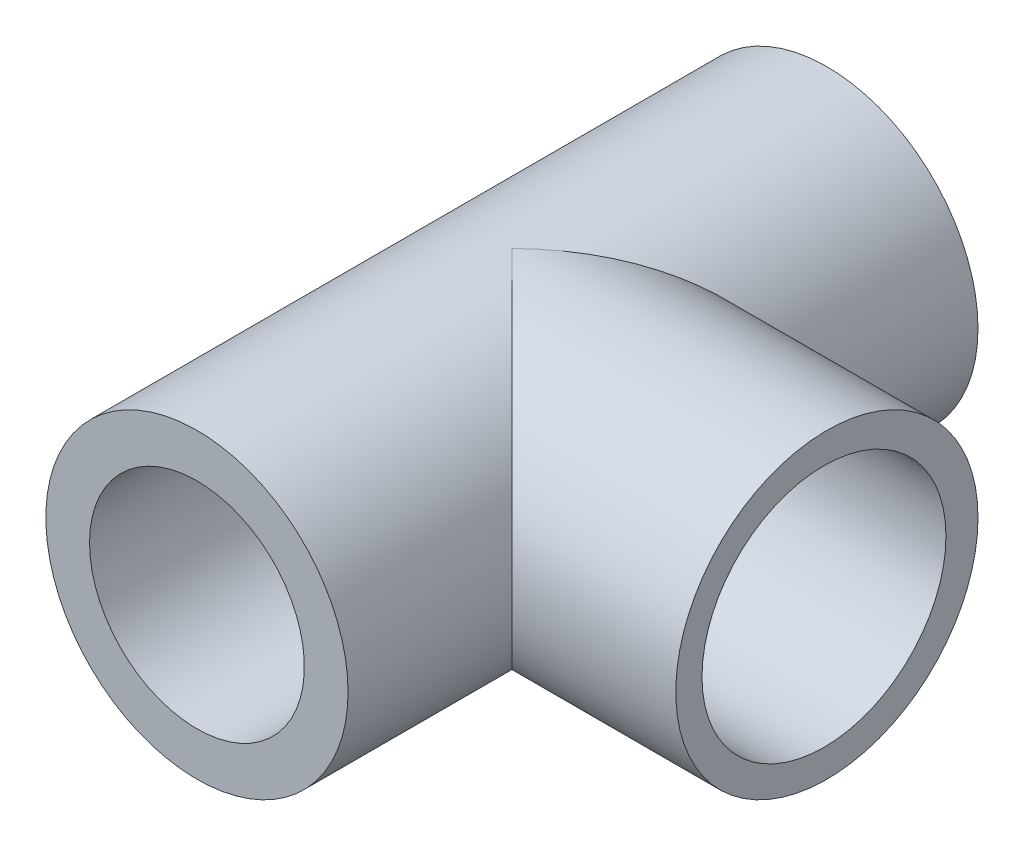
ISO-10303-21;
HEADER;
FILE_DESCRIPTION(('STEP AP214'),'2;1');
FILE_NAME('part.step','',(''),(''),'','','');
FILE_SCHEMA(('AUTOMOTIVE_DESIGN { 1 0 10303 214 1 1 1 1 }'));
ENDSEC;
DATA;
#1=APPLICATION_CONTEXT('core data for automotive mechanical design processes');
#2=APPLICATION_PROTOCOL_DEFINITION('international standard','automotive_design',2000,#1);
#3=PRODUCT_CONTEXT('',#1,'mechanical');
#4=PRODUCT('Part','Part','',(#3));
#5=PRODUCT_RELATED_PRODUCT_CATEGORY('part','',(#4));
#6=PRODUCT_DEFINITION_FORMATION('','',#4);
#7=PRODUCT_DEFINITION_CONTEXT('part definition',#1,'design');
#8=PRODUCT_DEFINITION('design','',#6,#7);
#9=PRODUCT_DEFINITION_SHAPE('','',#8);
#10=(LENGTH_UNIT() NAMED_UNIT(*) SI_UNIT(.MILLI.,.METRE.));
#11=(NAMED_UNIT(*) PLANE_ANGLE_UNIT() SI_UNIT($,.RADIAN.));
#12=(NAMED_UNIT(*) SI_UNIT($,.STERADIAN.) SOLID_ANGLE_UNIT());
#13=UNCERTAINTY_MEASURE_WITH_UNIT(LENGTH_MEASURE(1.E-05),#10,'distance_accuracy_value','');
#14=(GEOMETRIC_REPRESENTATION_CONTEXT(3) GLOBAL_UNCERTAINTY_ASSIGNED_CONTEXT((#13)) GLOBAL_UNIT_ASSIGNED_CONTEXT((#10,
#11,#12)) REPRESENTATION_CONTEXT('',''));
#15=CARTESIAN_POINT('',(0.,0.,0.));
#16=DIRECTION('',(0.,0.,1.));
#17=DIRECTION('',(1.,0.,0.));
#18=AXIS2_PLACEMENT_3D('',#15,#16,#17);
#19=CARTESIAN_POINT('',(8.5328125,0.,34.6470305744175));
#20=DIRECTION('',(1.,0.,0.));
#21=DIRECTION('',(0.,0.,-1.));
#22=AXIS2_PLACEMENT_3D('',#19,#20,#21);
#23=PLANE('',#22);
#24=DIRECTION('',(0.,0.,-1.));
#25=VECTOR('',#24,1.);
#26=CARTESIAN_POINT('',(8.5328125,-8.0164820448249,68.659375));
#27=LINE('',#26,#25);
#28=CARTESIAN_POINT('',(8.5328125,-8.0164820448249,45.2536959362387));
#29=VERTEX_POINT('',#28);
#30=CARTESIAN_POINT('',(8.5328125,-8.01648204482489,42.8625));
#31=VERTEX_POINT('',#30);
#32=EDGE_CURVE('E109',#29,#31,#27,.T.);
#33=ORIENTED_EDGE('',*,*,#32,.F.);
#34=CARTESIAN_POINT('',(8.5328125,0.,34.6470305744175));
#35=DIRECTION('',(1.,0.,0.));
#36=DIRECTION('',(0.,0.,-1.));
#37=AXIS2_PLACEMENT_3D('',#34,#35,#36);
#38=CIRCLE('',#37,13.2953125);
#39=CARTESIAN_POINT('',(8.5328125,-8.0164820448249,24.0403652125964));
#40=VERTEX_POINT('',#39);
#41=EDGE_CURVE('E107',#29,#40,#38,.T.);
#42=ORIENTED_EDGE('',*,*,#41,.T.);
#43=CARTESIAN_POINT('',(8.5328125,-8.01648204482489,25.796875));
#44=VERTEX_POINT('',#43);
#45=EDGE_CURVE('E95',#44,#40,#27,.T.);
#46=ORIENTED_EDGE('',*,*,#45,.F.);
#47=CARTESIAN_POINT('',(8.5328125,0.,34.3296875));
#48=DIRECTION('',(1.,0.,0.));
#49=DIRECTION('',(0.,0.,-1.));
#50=AXIS2_PLACEMENT_3D('',#47,#48,#49);
#51=CIRCLE('',#50,11.7078125);
#52=EDGE_CURVE('E105',#44,#31,#51,.F.);
#53=ORIENTED_EDGE('',*,*,#52,.T.);
#54=EDGE_LOOP('',(#33,#42,#46,#53));
#55=FACE_BOUND('',#54,.T.);
#56=ADVANCED_FACE('F41',(#55),#23,.T.);
#57=CARTESIAN_POINT('',(0.,0.,34.3296875));
#58=DIRECTION('',(1.,0.,0.));
#59=DIRECTION('',(0.,0.,-1.));
#60=AXIS2_PLACEMENT_3D('',#57,#58,#59);
#61=CYLINDRICAL_SURFACE('',#60,11.7078125);
#62=CARTESIAN_POINT('',(8.5328125,8.0164820448249,42.8625));
#63=VERTEX_POINT('',#62);
#64=CARTESIAN_POINT('',(8.5328125,8.0164820448249,25.796875));
#65=VERTEX_POINT('',#64);
#66=EDGE_CURVE('E115',#63,#65,#51,.F.);
#67=ORIENTED_EDGE('',*,*,#66,.F.);
#68=CARTESIAN_POINT('',(0.,0.,34.3296875));
#69=DIRECTION('',(0.707106781186547,0.,-0.707106781186547));
#70=DIRECTION('',(0.707106781186547,0.,0.707106781186547));
#71=AXIS2_PLACEMENT_3D('',#68,#69,#70);
#72=ELLIPSE('',#71,16.5573472232212,11.7078125);
#73=CARTESIAN_POINT('',(0.,11.7078125,34.3296875));
#74=VERTEX_POINT('',#73);
#75=EDGE_CURVE('E11',#63,#74,#72,.F.);
#76=ORIENTED_EDGE('',*,*,#75,.T.);
#77=CARTESIAN_POINT('',(0.,0.,34.3296875));
#78=DIRECTION('',(0.707106781186547,0.,0.707106781186547));
#79=DIRECTION('',(0.707106781186547,0.,-0.707106781186547));
#80=AXIS2_PLACEMENT_3D('',#77,#78,#79);
#81=ELLIPSE('',#80,16.5573472232212,11.7078125);
#82=EDGE_CURVE('E51',#74,#65,#81,.F.);
#83=ORIENTED_EDGE('',*,*,#82,.T.);
#84=EDGE_LOOP('',(#67,#76,#83));
#85=FACE_BOUND('',#84,.T.);
#86=ADVANCED_FACE('F184',(#85),#61,.F.);
#87=CARTESIAN_POINT('',(0.,0.,68.659375));
#88=DIRECTION('',(0.,0.,-1.));
#89=DIRECTION('',(-1.,0.,0.));
#90=AXIS2_PLACEMENT_3D('',#87,#88,#89);
#91=CYLINDRICAL_SURFACE('',#90,16.4703125);
#92=CARTESIAN_POINT('',(0.,0.,0.));
#93=DIRECTION('',(0.,0.,1.));
#94=DIRECTION('',(1.,0.,0.));
#95=AXIS2_PLACEMENT_3D('',#92,#93,#94);
#96=CIRCLE('',#95,16.4703125);
#97=CARTESIAN_POINT('',(16.4703125,0.,0.));
#98=VERTEX_POINT('',#97);
#99=EDGE_CURVE('E120',#98,#98,#96,.T.);
#100=ORIENTED_EDGE('',*,*,#99,.T.);
#101=EDGE_LOOP('',(#100));
#102=FACE_BOUND('',#101,.T.);
#103=CARTESIAN_POINT('',(0.,0.,68.659375));
#104=DIRECTION('',(0.,0.,1.));
#105=DIRECTION('',(1.,0.,0.));
#106=AXIS2_PLACEMENT_3D('',#103,#104,#105);
#107=CIRCLE('',#106,16.4703125);
#108=CARTESIAN_POINT('',(16.4703125,0.,68.659375));
#109=VERTEX_POINT('',#108);
#110=EDGE_CURVE('E129',#109,#109,#107,.T.);
#111=ORIENTED_EDGE('',*,*,#110,.F.);
#112=EDGE_LOOP('',(#111));
#113=FACE_BOUND('',#112,.T.);
#114=CARTESIAN_POINT('',(0.,0.,34.3296875));
#115=DIRECTION('',(-0.707106781186547,0.,-0.707106781186547));
#116=DIRECTION('',(0.707106781186547,0.,-0.707106781186547));
#117=AXIS2_PLACEMENT_3D('',#114,#115,#116);
#118=ELLIPSE('',#117,23.2925393140231,16.4703125);
#119=CARTESIAN_POINT('',(0.,-16.4703125,34.3296875));
#120=VERTEX_POINT('',#119);
#121=CARTESIAN_POINT('',(0.,16.4703125,34.3296875));
#122=VERTEX_POINT('',#121);
#123=EDGE_CURVE('E100',#120,#122,#118,.F.);
#124=ORIENTED_EDGE('',*,*,#123,.F.);
#125=CARTESIAN_POINT('',(0.,0.,34.3296875));
#126=DIRECTION('',(0.707106781186547,0.,-0.707106781186547));
#127=DIRECTION('',(-0.707106781186547,0.,-0.707106781186547));
#128=AXIS2_PLACEMENT_3D('',#125,#126,#127);
#129=ELLIPSE('',#128,23.2925393140231,16.4703125);
#130=EDGE_CURVE('E64',#122,#120,#129,.T.);
#131=ORIENTED_EDGE('',*,*,#130,.F.);
#132=EDGE_LOOP('',(#124,#131));
#133=FACE_BOUND('',#132,.T.);
#134=ADVANCED_FACE('F43',(#102,#113,#133),#91,.T.);
#135=CARTESIAN_POINT('',(0.,0.,68.659375));
#136=DIRECTION('',(0.,0.,1.));
#137=DIRECTION('',(1.,0.,0.));
#138=AXIS2_PLACEMENT_3D('',#135,#136,#137);
#139=PLANE('',#138);
#140=CARTESIAN_POINT('',(0.,0.,68.659375));
#141=DIRECTION('',(0.,0.,-1.));
#142=DIRECTION('',(-1.,0.,0.));
#143=AXIS2_PLACEMENT_3D('',#140,#141,#142);
#144=CIRCLE('',#143,11.7078125);
#145=CARTESIAN_POINT('',(-11.7078125,0.,68.659375));
#146=VERTEX_POINT('',#145);
#147=EDGE_CURVE('E110',#146,#146,#144,.T.);
#148=ORIENTED_EDGE('',*,*,#147,.T.);
#149=EDGE_LOOP('',(#148));
#150=FACE_BOUND('',#149,.T.);
#151=ORIENTED_EDGE('',*,*,#110,.T.);
#152=EDGE_LOOP('',(#151));
#153=FACE_BOUND('',#152,.T.);
#154=ADVANCED_FACE('F192',(#150,#153),#139,.T.);
#155=CARTESIAN_POINT('',(0.,0.,0.));
#156=DIRECTION('',(0.,0.,1.));
#157=DIRECTION('',(1.,0.,0.));
#158=AXIS2_PLACEMENT_3D('',#155,#156,#157);
#159=PLANE('',#158);
#160=CARTESIAN_POINT('',(0.,0.,0.));
#161=DIRECTION('',(0.,0.,-1.));
#162=DIRECTION('',(-1.,0.,0.));
#163=AXIS2_PLACEMENT_3D('',#160,#161,#162);
#164=CIRCLE('',#163,11.7078125);
#165=CARTESIAN_POINT('',(-11.7078125,0.,0.));
#166=VERTEX_POINT('',#165);
#167=EDGE_CURVE('E272',#166,#166,#164,.T.);
#168=ORIENTED_EDGE('',*,*,#167,.F.);
#169=EDGE_LOOP('',(#168));
#170=FACE_BOUND('',#169,.T.);
#171=ORIENTED_EDGE('',*,*,#99,.F.);
#172=EDGE_LOOP('',(#171));
#173=FACE_BOUND('',#172,.T.);
#174=ADVANCED_FACE('F239',(#170,#173),#159,.F.);
#175=CARTESIAN_POINT('',(34.3296875,0.,34.3296875));
#176=DIRECTION('',(-1.,0.,0.));
#177=DIRECTION('',(0.,0.,1.));
#178=AXIS2_PLACEMENT_3D('',#175,#176,#177);
#179=CYLINDRICAL_SURFACE('',#178,16.4703125);
#180=CARTESIAN_POINT('',(34.3296875,0.,34.3296875));
#181=DIRECTION('',(1.,0.,0.));
#182=DIRECTION('',(0.,0.,-1.));
#183=AXIS2_PLACEMENT_3D('',#180,#181,#182);
#184=CIRCLE('',#183,16.4703125);
#185=CARTESIAN_POINT('',(34.3296875,0.,17.859375));
#186=VERTEX_POINT('',#185);
#187=EDGE_CURVE('E114',#186,#186,#184,.T.);
#188=ORIENTED_EDGE('',*,*,#187,.F.);
#189=EDGE_LOOP('',(#188));
#190=FACE_BOUND('',#189,.T.);
#191=ORIENTED_EDGE('',*,*,#130,.T.);
#192=ORIENTED_EDGE('',*,*,#123,.T.);
#193=EDGE_LOOP('',(#191,#192));
#194=FACE_BOUND('',#193,.T.);
#195=ADVANCED_FACE('F179',(#190,#194),#179,.T.);
#196=CARTESIAN_POINT('',(34.3296875,0.,34.3296875));
#197=DIRECTION('',(1.,0.,0.));
#198=DIRECTION('',(0.,0.,-1.));
#199=AXIS2_PLACEMENT_3D('',#196,#197,#198);
#200=PLANE('',#199);
#201=CARTESIAN_POINT('',(34.3296875,0.,34.6470305744175));
#202=DIRECTION('',(1.,0.,0.));
#203=DIRECTION('',(0.,0.,-1.));
#204=AXIS2_PLACEMENT_3D('',#201,#202,#203);
#205=CIRCLE('',#204,13.2953125);
#206=CARTESIAN_POINT('',(34.3296875,0.,21.3517180744175));
#207=VERTEX_POINT('',#206);
#208=EDGE_CURVE('E136',#207,#207,#205,.T.);
#209=ORIENTED_EDGE('',*,*,#208,.F.);
#210=EDGE_LOOP('',(#209));
#211=FACE_BOUND('',#210,.T.);
#212=ORIENTED_EDGE('',*,*,#187,.T.);
#213=EDGE_LOOP('',(#212));
#214=FACE_BOUND('',#213,.T.);
#215=ADVANCED_FACE('F172',(#211,#214),#200,.T.);
#216=DIRECTION('',(0.,0.,-1.));
#217=VECTOR('',#216,1.);
#218=CARTESIAN_POINT('',(8.5328125,8.0164820448249,68.659375));
#219=LINE('',#218,#217);
#220=CARTESIAN_POINT('',(8.5328125,8.0164820448249,24.0403652125964));
#221=VERTEX_POINT('',#220);
#222=EDGE_CURVE('E140',#221,#65,#219,.F.);
#223=ORIENTED_EDGE('',*,*,#222,.F.);
#224=CARTESIAN_POINT('',(8.5328125,8.0164820448249,45.2536959362387));
#225=VERTEX_POINT('',#224);
#226=EDGE_CURVE('E123',#221,#225,#38,.T.);
#227=ORIENTED_EDGE('',*,*,#226,.T.);
#228=EDGE_CURVE('E144',#63,#225,#219,.F.);
#229=ORIENTED_EDGE('',*,*,#228,.F.);
#230=ORIENTED_EDGE('',*,*,#66,.T.);
#231=EDGE_LOOP('',(#223,#227,#229,#230));
#232=FACE_BOUND('',#231,.T.);
#233=ADVANCED_FACE('F169',(#232),#23,.T.);
#234=CARTESIAN_POINT('',(8.5328125,0.,34.6470305744175));
#235=DIRECTION('',(1.,0.,0.));
#236=DIRECTION('',(0.,0.,-1.));
#237=AXIS2_PLACEMENT_3D('',#234,#235,#236);
#238=CYLINDRICAL_SURFACE('',#237,13.2953125);
#239=ORIENTED_EDGE('',*,*,#41,.F.);
#240=CARTESIAN_POINT('',(8.5328125,-8.0164820448249,45.2536959362387));
#241=CARTESIAN_POINT('',(8.72890101178697,-7.80773782197861,45.4114771458775));
#242=CARTESIAN_POINT('',(8.91866696131001,-7.59042340095997,45.5660254481017));
#243=CARTESIAN_POINT('',(9.28441040605854,-7.13844176275085,45.8667318873889));
#244=CARTESIAN_POINT('',(9.46036893816848,-6.90375151199532,46.0128784143072));
#245=CARTESIAN_POINT('',(9.79808637693156,-6.41553515165995,46.2954814489118));
#246=CARTESIAN_POINT('',(9.95972813405647,-6.16188028886602,46.4318565281448));
#247=CARTESIAN_POINT('',(10.2654371194852,-5.6378732956996,46.6913286770782));
#248=CARTESIAN_POINT('',(10.4095135008709,-5.36752997304911,46.8144326582649));
#249=CARTESIAN_POINT('',(10.6559355803692,-4.85699736949685,47.0259694575789));
#250=CARTESIAN_POINT('',(10.7612420478127,-4.61921608636038,47.1167691464204));
#251=CARTESIAN_POINT('',(10.9570195222991,-4.13341828985814,47.2861097638865));
#252=CARTESIAN_POINT('',(11.0474935211812,-3.88540385327353,47.3646531645579));
#253=CARTESIAN_POINT('',(11.2121429577322,-3.38096240448729,47.507939214743));
#254=CARTESIAN_POINT('',(11.2863642613359,-3.12456147598377,47.5727206852601));
#255=CARTESIAN_POINT('',(11.4176724920056,-2.60415646472054,47.6875324956594));
#256=CARTESIAN_POINT('',(11.4747596885235,-2.34015250159813,47.7375630675149));
#257=CARTESIAN_POINT('',(11.5711349601488,-1.80451122016918,47.8221239804047));
#258=CARTESIAN_POINT('',(11.610296783073,-1.53283364672165,47.8565443604323));
#259=CARTESIAN_POINT('',(11.6694803626076,-0.985791015268656,47.9085928470477));
#260=CARTESIAN_POINT('',(11.6895019072841,-0.71042591646666,47.9262207676982));
#261=CARTESIAN_POINT('',(11.710003160003,-0.158283914775586,47.9442713143612));
#262=CARTESIAN_POINT('',(11.7104743909105,0.118493548502463,47.9446864768168));
#263=CARTESIAN_POINT('',(11.6918420524494,0.670860128265111,47.928280944949));
#264=CARTESIAN_POINT('',(11.6727398532898,0.946449326576323,47.9114614571117));
#265=CARTESIAN_POINT('',(11.6181831965574,1.46708021452744,47.8634784112041));
#266=CARTESIAN_POINT('',(11.5845226715159,1.71245947358449,47.8338890881977));
#267=CARTESIAN_POINT('',(11.5021441536161,2.19871797650703,47.761579415468));
#268=CARTESIAN_POINT('',(11.4534254886102,2.43959701898799,47.7188584795915));
#269=CARTESIAN_POINT('',(11.3416565503991,2.91537534114862,47.6210393599123));
#270=CARTESIAN_POINT('',(11.2786088874855,3.15027570129965,47.5659434304644));
#271=CARTESIAN_POINT('',(11.1390182093329,3.61296978364089,47.4442575609299));
#272=CARTESIAN_POINT('',(11.062474597056,3.84076319090657,47.3776671123481));
#273=CARTESIAN_POINT('',(10.8920284911145,4.30119465309535,47.2298300699175));
#274=CARTESIAN_POINT('',(10.7973799321653,4.53335562734828,47.1479600929696));
#275=CARTESIAN_POINT('',(10.5950710142502,4.98791197015893,46.9736422399046));
#276=CARTESIAN_POINT('',(10.487405723303,5.21030359336752,46.8811903550614));
#277=CARTESIAN_POINT('',(10.2601146542697,5.64473635898065,46.6869196018081));
#278=CARTESIAN_POINT('',(10.1404843282723,5.85677351972898,46.5850971728364));
#279=CARTESIAN_POINT('',(9.8902739618812,6.27006516409971,46.3733068029686));
#280=CARTESIAN_POINT('',(9.75969216910489,6.47131791359428,46.2633375588017));
#281=CARTESIAN_POINT('',(9.45630368478822,6.90927276509099,46.0094965192659));
#282=CARTESIAN_POINT('',(9.28083053609682,7.14305333849247,45.8637724197562));
#283=CARTESIAN_POINT('',(8.91655642974811,7.59284173563018,45.5643063172713));
#284=CARTESIAN_POINT('',(8.72780459675764,7.80890926333424,45.4105943656232));
#285=CARTESIAN_POINT('',(8.5328125,8.0164820448249,45.2536959362387));
#286=B_SPLINE_CURVE_WITH_KNOTS('',3,(#240,#241,#242,#243,#244,#245,#246,#247,#248,#249,#250,
#251,#252,#253,#254,#255,#256,#257,#258,#259,#260,#261,#262,#263,#264,#265,#266,#267,#268,#269,
#270,#271,#272,#273,#274,#275,#276,#277,#278,#279,#280,#281,#282,#283,#284,#285),.UNSPECIFIED.,
.F.,.F.,(4,2,2,2,2,2,2,2,2,2,2,2,2,2,2,2,2,2,2,2,2,2,4),(0.,0.980948678495349,1.96322183345979,
2.95290603880762,3.94207230855386,4.76763630578725,5.59303357407598,6.41607061984179,
7.23909472180484,8.06782958203569,8.89657361847208,9.72567699961188,10.5547223445627,
11.3021932504509,12.0496975258984,12.7970657386421,13.544467021992,14.3349314892972,
15.1256964042517,15.9167630396492,16.707956498789,17.6869114671665,18.662418054043),.UNSPECIFIED.);
#287=EDGE_CURVE('E147',#29,#225,#286,.T.);
#288=ORIENTED_EDGE('',*,*,#287,.T.);
#289=ORIENTED_EDGE('',*,*,#226,.F.);
#290=CARTESIAN_POINT('',(8.5328125,8.0164820448249,24.0403652125964));
#291=CARTESIAN_POINT('',(8.72890101178697,7.80773782197861,23.8825840029575));
#292=CARTESIAN_POINT('',(8.91866696131001,7.59042340095997,23.7280357007334));
#293=CARTESIAN_POINT('',(9.28441040605854,7.13844176275085,23.4273292614462));
#294=CARTESIAN_POINT('',(9.46036893816847,6.90375151199532,23.2811827345278));
#295=CARTESIAN_POINT('',(9.79808637693156,6.41553515165995,22.9985796999233));
#296=CARTESIAN_POINT('',(9.95972813405646,6.16188028886602,22.8622046206902));
#297=CARTESIAN_POINT('',(10.2654371194852,5.6378732956996,22.6027324717569));
#298=CARTESIAN_POINT('',(10.4095135008709,5.36752997304912,22.4796284905702));
#299=CARTESIAN_POINT('',(10.6559355803692,4.85699736949685,22.2680916912561));
#300=CARTESIAN_POINT('',(10.7612420478127,4.61921608636038,22.1772920024147));
#301=CARTESIAN_POINT('',(10.9570195222991,4.13341828985814,22.0079513849485));
#302=CARTESIAN_POINT('',(11.0474935211812,3.88540385327353,21.9294079842771));
#303=CARTESIAN_POINT('',(11.2121429577322,3.38096240448729,21.786121934092));
#304=CARTESIAN_POINT('',(11.2863642613359,3.12456147598377,21.721340463575));
#305=CARTESIAN_POINT('',(11.4176724920056,2.60415646472054,21.6065286531757));
#306=CARTESIAN_POINT('',(11.4747596885235,2.34015250159812,21.5564980813202));
#307=CARTESIAN_POINT('',(11.5711349601488,1.80451122016918,21.4719371684304));
#308=CARTESIAN_POINT('',(11.610296783073,1.53283364672165,21.4375167884028));
#309=CARTESIAN_POINT('',(11.6694803626076,0.985791015268655,21.3854683017873));
#310=CARTESIAN_POINT('',(11.6895019072841,0.710425916466659,21.3678403811368));
#311=CARTESIAN_POINT('',(11.710003160003,0.158283914775585,21.3497898344739));
#312=CARTESIAN_POINT('',(11.7104743909105,-0.118493548502464,21.3493746720182));
#313=CARTESIAN_POINT('',(11.6918420524494,-0.670860128265112,21.3657802038861));
#314=CARTESIAN_POINT('',(11.6727398532898,-0.946449326576325,21.3825996917234));
#315=CARTESIAN_POINT('',(11.6181831965574,-1.46708021452744,21.430582737631));
#316=CARTESIAN_POINT('',(11.5845226715159,-1.71245947358449,21.4601720606374));
#317=CARTESIAN_POINT('',(11.5021441536161,-2.19871797650703,21.5324817333671));
#318=CARTESIAN_POINT('',(11.4534254886102,-2.43959701898799,21.5752026692436));
#319=CARTESIAN_POINT('',(11.3416565503991,-2.91537534114862,21.6730217889228));
#320=CARTESIAN_POINT('',(11.2786088874855,-3.15027570129966,21.7281177183707));
#321=CARTESIAN_POINT('',(11.1390182093329,-3.61296978364089,21.8498035879051));
#322=CARTESIAN_POINT('',(11.062474597056,-3.84076319090658,21.916394036487));
#323=CARTESIAN_POINT('',(10.8920284911145,-4.30119465309535,22.0642310789175));
#324=CARTESIAN_POINT('',(10.7973799321653,-4.53335562734828,22.1461010558655));
#325=CARTESIAN_POINT('',(10.5950710142502,-4.98791197015893,22.3204189089305));
#326=CARTESIAN_POINT('',(10.487405723303,-5.21030359336752,22.4128707937737));
#327=CARTESIAN_POINT('',(10.2601146542697,-5.64473635898065,22.607141547027));
#328=CARTESIAN_POINT('',(10.1404843282723,-5.85677351972898,22.7089639759986));
#329=CARTESIAN_POINT('',(9.8902739618812,-6.27006516409971,22.9207543458665));
#330=CARTESIAN_POINT('',(9.75969216910489,-6.47131791359428,23.0307235900334));
#331=CARTESIAN_POINT('',(9.45630368478821,-6.90927276509099,23.2845646295692));
#332=CARTESIAN_POINT('',(9.28083053609681,-7.14305333849247,23.4302887290789));
#333=CARTESIAN_POINT('',(8.91655642974811,-7.59284173563017,23.7297548315638));
#334=CARTESIAN_POINT('',(8.72780459675764,-7.80890926333424,23.8834667832118));
#335=CARTESIAN_POINT('',(8.5328125,-8.0164820448249,24.0403652125964));
#336=B_SPLINE_CURVE_WITH_KNOTS('',3,(#290,#291,#292,#293,#294,#295,#296,#297,#298,#299,#300,
#301,#302,#303,#304,#305,#306,#307,#308,#309,#310,#311,#312,#313,#314,#315,#316,#317,#318,#319,
#320,#321,#322,#323,#324,#325,#326,#327,#328,#329,#330,#331,#332,#333,#334,#335),.UNSPECIFIED.,
.F.,.F.,(4,2,2,2,2,2,2,2,2,2,2,2,2,2,2,2,2,2,2,2,2,2,4),(0.,0.980948678495351,1.96322183345978,
2.95290603880761,3.94207230855386,4.76763630578725,5.59303357407597,6.41607061984179,
7.23909472180484,8.06782958203568,8.89657361847207,9.72567699961188,10.5547223445627,
11.3021932504509,12.0496975258984,12.7970657386421,13.544467021992,14.3349314892972,
15.1256964042517,15.9167630396492,16.707956498789,17.6869114671665,18.662418054043),.UNSPECIFIED.);
#337=EDGE_CURVE('E157',#221,#40,#336,.T.);
#338=ORIENTED_EDGE('',*,*,#337,.T.);
#339=EDGE_LOOP('',(#239,#288,#289,#338));
#340=FACE_BOUND('',#339,.T.);
#341=ORIENTED_EDGE('',*,*,#208,.T.);
#342=EDGE_LOOP('',(#341));
#343=FACE_BOUND('',#342,.T.);
#344=ADVANCED_FACE('F162',(#340,#343),#238,.F.);
#345=CARTESIAN_POINT('',(0.,-11.7078125,34.3296875));
#346=VERTEX_POINT('',#345);
#347=EDGE_CURVE('E92',#44,#346,#81,.F.);
#348=ORIENTED_EDGE('',*,*,#347,.T.);
#349=EDGE_CURVE('E45',#346,#31,#72,.F.);
#350=ORIENTED_EDGE('',*,*,#349,.T.);
#351=ORIENTED_EDGE('',*,*,#52,.F.);
#352=EDGE_LOOP('',(#348,#350,#351));
#353=FACE_BOUND('',#352,.T.);
#354=ADVANCED_FACE('F112',(#353),#61,.F.);
#355=CARTESIAN_POINT('',(0.,0.,68.659375));
#356=DIRECTION('',(0.,0.,-1.));
#357=DIRECTION('',(-1.,0.,0.));
#358=AXIS2_PLACEMENT_3D('',#355,#356,#357);
#359=CYLINDRICAL_SURFACE('',#358,11.7078125);
#360=ORIENTED_EDGE('',*,*,#147,.F.);
#361=EDGE_LOOP('',(#360));
#362=FACE_BOUND('',#361,.T.);
#363=ORIENTED_EDGE('',*,*,#167,.T.);
#364=EDGE_LOOP('',(#363));
#365=FACE_BOUND('',#364,.T.);
#366=ORIENTED_EDGE('',*,*,#228,.T.);
#367=ORIENTED_EDGE('',*,*,#287,.F.);
#368=ORIENTED_EDGE('',*,*,#32,.T.);
#369=ORIENTED_EDGE('',*,*,#349,.F.);
#370=ORIENTED_EDGE('',*,*,#347,.F.);
#371=ORIENTED_EDGE('',*,*,#45,.T.);
#372=ORIENTED_EDGE('',*,*,#337,.F.);
#373=ORIENTED_EDGE('',*,*,#222,.T.);
#374=ORIENTED_EDGE('',*,*,#82,.F.);
#375=ORIENTED_EDGE('',*,*,#75,.F.);
#376=EDGE_LOOP('',(#366,#367,#368,#369,#370,#371,#372,#373,#374,#375));
#377=FACE_BOUND('',#376,.T.);
#378=ADVANCED_FACE('F94',(#362,#365,#377),#359,.F.);
#379=CLOSED_SHELL('',(#56,#86,#134,#154,#174,#195,#215,#233,#344,#354,#378));
#380=MANIFOLD_SOLID_BREP('B2',#379);
#381=ADVANCED_BREP_SHAPE_REPRESENTATION('',(#18,#380),#14);
#382=SHAPE_DEFINITION_REPRESENTATION(#9,#381);
ENDSEC;
END-ISO-10303-21;
